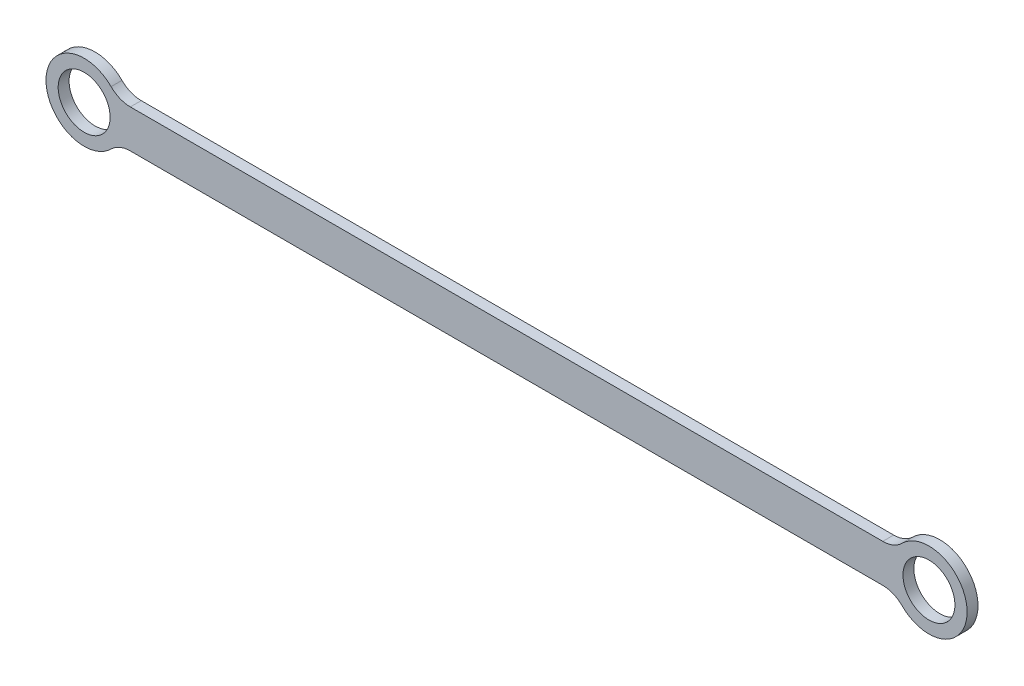
ISO-10303-21;
HEADER;
FILE_DESCRIPTION(('STEP AP214'),'2;1');
FILE_NAME('part.step','',(''),(''),'','','');
FILE_SCHEMA(('AUTOMOTIVE_DESIGN { 1 0 10303 214 1 1 1 1 }'));
ENDSEC;
DATA;
#1=APPLICATION_CONTEXT('core data for automotive mechanical design processes');
#2=APPLICATION_PROTOCOL_DEFINITION('international standard','automotive_design',2000,#1);
#3=PRODUCT_CONTEXT('',#1,'mechanical');
#4=PRODUCT('Part','Part','',(#3));
#5=PRODUCT_RELATED_PRODUCT_CATEGORY('part','',(#4));
#6=PRODUCT_DEFINITION_FORMATION('','',#4);
#7=PRODUCT_DEFINITION_CONTEXT('part definition',#1,'design');
#8=PRODUCT_DEFINITION('design','',#6,#7);
#9=PRODUCT_DEFINITION_SHAPE('','',#8);
#10=(LENGTH_UNIT() NAMED_UNIT(*) SI_UNIT(.MILLI.,.METRE.));
#11=(NAMED_UNIT(*) PLANE_ANGLE_UNIT() SI_UNIT($,.RADIAN.));
#12=(NAMED_UNIT(*) SI_UNIT($,.STERADIAN.) SOLID_ANGLE_UNIT());
#13=UNCERTAINTY_MEASURE_WITH_UNIT(LENGTH_MEASURE(1.E-05),#10,'distance_accuracy_value','');
#14=(GEOMETRIC_REPRESENTATION_CONTEXT(3) GLOBAL_UNCERTAINTY_ASSIGNED_CONTEXT((#13)) GLOBAL_UNIT_ASSIGNED_CONTEXT((#10,
#11,#12)) REPRESENTATION_CONTEXT('',''));
#15=CARTESIAN_POINT('',(0.,0.,0.));
#16=DIRECTION('',(0.,0.,1.));
#17=DIRECTION('',(1.,0.,0.));
#18=AXIS2_PLACEMENT_3D('',#15,#16,#17);
#19=CARTESIAN_POINT('',(138.057525521744,16.9986046060747,4.));
#20=DIRECTION('',(0.,0.,-1.));
#21=DIRECTION('',(-1.,0.,0.));
#22=AXIS2_PLACEMENT_3D('',#19,#20,#21);
#23=PLANE('',#22);
#24=CARTESIAN_POINT('',(138.057525521744,16.9986046060747,4.));
#25=DIRECTION('',(0.,0.,-1.));
#26=DIRECTION('',(-1.,0.,0.));
#27=AXIS2_PLACEMENT_3D('',#24,#25,#26);
#28=CIRCLE('',#27,10.);
#29=CARTESIAN_POINT('',(145.116889887684,9.91585268687692,4.));
#30=VERTEX_POINT('',#29);
#31=CARTESIAN_POINT('',(138.057525521744,6.99860460607469,4.));
#32=VERTEX_POINT('',#31);
#33=EDGE_CURVE('E164',#30,#32,#28,.T.);
#34=ORIENTED_EDGE('',*,*,#33,.T.);
#35=DIRECTION('',(-1.,0.,0.));
#36=VECTOR('',#35,1.);
#37=CARTESIAN_POINT('',(-138.057525521746,6.99860460607469,4.));
#38=LINE('',#37,#36);
#39=CARTESIAN_POINT('',(-138.057525521746,6.99860460607469,4.));
#40=VERTEX_POINT('',#39);
#41=EDGE_CURVE('E100',#32,#40,#38,.T.);
#42=ORIENTED_EDGE('',*,*,#41,.T.);
#43=CARTESIAN_POINT('',(-138.057525521746,16.9986046060747,4.));
#44=DIRECTION('',(0.,0.,-1.));
#45=DIRECTION('',(-1.,0.,0.));
#46=AXIS2_PLACEMENT_3D('',#43,#44,#45);
#47=CIRCLE('',#46,10.);
#48=CARTESIAN_POINT('',(-145.116889887685,9.9158526868767,4.));
#49=VERTEX_POINT('',#48);
#50=EDGE_CURVE('E185',#40,#49,#47,.T.);
#51=ORIENTED_EDGE('',*,*,#50,.T.);
#52=CARTESIAN_POINT('',(-155.,0.,4.));
#53=DIRECTION('',(0.,0.,1.));
#54=DIRECTION('',(-1.,0.,0.));
#55=AXIS2_PLACEMENT_3D('',#52,#53,#54);
#56=CIRCLE('',#55,13.9999999999993);
#57=CARTESIAN_POINT('',(-145.116889887685,-9.91585268687668,4.));
#58=VERTEX_POINT('',#57);
#59=EDGE_CURVE('E199',#49,#58,#56,.T.);
#60=ORIENTED_EDGE('',*,*,#59,.T.);
#61=CARTESIAN_POINT('',(-138.057525521746,-16.9986046060747,4.));
#62=DIRECTION('',(0.,0.,-1.));
#63=DIRECTION('',(1.,0.,0.));
#64=AXIS2_PLACEMENT_3D('',#61,#62,#63);
#65=CIRCLE('',#64,10.);
#66=CARTESIAN_POINT('',(-138.057525521746,-6.99860460607466,4.));
#67=VERTEX_POINT('',#66);
#68=EDGE_CURVE('E119',#58,#67,#65,.T.);
#69=ORIENTED_EDGE('',*,*,#68,.T.);
#70=DIRECTION('',(1.,0.,0.));
#71=VECTOR('',#70,1.);
#72=CARTESIAN_POINT('',(138.057525521744,-6.99860460607466,4.));
#73=LINE('',#72,#71);
#74=CARTESIAN_POINT('',(138.057525521744,-6.99860460607465,4.));
#75=VERTEX_POINT('',#74);
#76=EDGE_CURVE('E113',#67,#75,#73,.T.);
#77=ORIENTED_EDGE('',*,*,#76,.T.);
#78=CARTESIAN_POINT('',(138.057525521744,-16.9986046060747,4.));
#79=DIRECTION('',(0.,0.,-1.));
#80=DIRECTION('',(1.,0.,0.));
#81=AXIS2_PLACEMENT_3D('',#78,#79,#80);
#82=CIRCLE('',#81,10.);
#83=CARTESIAN_POINT('',(145.116889887684,-9.9158526868769,4.));
#84=VERTEX_POINT('',#83);
#85=EDGE_CURVE('E117',#75,#84,#82,.T.);
#86=ORIENTED_EDGE('',*,*,#85,.T.);
#87=CARTESIAN_POINT('',(155.,0.,4.));
#88=DIRECTION('',(0.,0.,1.));
#89=DIRECTION('',(-1.,0.,0.));
#90=AXIS2_PLACEMENT_3D('',#87,#88,#89);
#91=CIRCLE('',#90,14.);
#92=EDGE_CURVE('E57',#84,#30,#91,.T.);
#93=ORIENTED_EDGE('',*,*,#92,.T.);
#94=EDGE_LOOP('',(#34,#42,#51,#60,#69,#77,#86,#93));
#95=FACE_BOUND('',#94,.T.);
#96=CARTESIAN_POINT('',(-155.,0.,4.));
#97=DIRECTION('',(0.,0.,1.));
#98=DIRECTION('',(1.,0.,0.));
#99=AXIS2_PLACEMENT_3D('',#96,#97,#98);
#100=CIRCLE('',#99,9.53000000000001);
#101=CARTESIAN_POINT('',(-145.47,0.,4.));
#102=VERTEX_POINT('',#101);
#103=EDGE_CURVE('E146',#102,#102,#100,.T.);
#104=ORIENTED_EDGE('',*,*,#103,.F.);
#105=EDGE_LOOP('',(#104));
#106=FACE_BOUND('',#105,.T.);
#107=CARTESIAN_POINT('',(155.,0.,4.));
#108=DIRECTION('',(0.,0.,1.));
#109=DIRECTION('',(1.,0.,0.));
#110=AXIS2_PLACEMENT_3D('',#107,#108,#109);
#111=CIRCLE('',#110,9.52999999999996);
#112=CARTESIAN_POINT('',(164.53,0.,4.));
#113=VERTEX_POINT('',#112);
#114=EDGE_CURVE('E213',#113,#113,#111,.T.);
#115=ORIENTED_EDGE('',*,*,#114,.F.);
#116=EDGE_LOOP('',(#115));
#117=FACE_BOUND('',#116,.T.);
#118=ADVANCED_FACE('F39',(#95,#106,#117),#23,.F.);
#119=CARTESIAN_POINT('',(138.057525521744,16.9986046060747,0.));
#120=DIRECTION('',(0.,0.,-1.));
#121=DIRECTION('',(-1.,0.,0.));
#122=AXIS2_PLACEMENT_3D('',#119,#120,#121);
#123=PLANE('',#122);
#124=CARTESIAN_POINT('',(-155.,0.,0.));
#125=DIRECTION('',(0.,0.,1.));
#126=DIRECTION('',(1.,0.,0.));
#127=AXIS2_PLACEMENT_3D('',#124,#125,#126);
#128=CIRCLE('',#127,9.53000000000001);
#129=CARTESIAN_POINT('',(-145.47,0.,0.));
#130=VERTEX_POINT('',#129);
#131=EDGE_CURVE('E209',#130,#130,#128,.T.);
#132=ORIENTED_EDGE('',*,*,#131,.T.);
#133=EDGE_LOOP('',(#132));
#134=FACE_BOUND('',#133,.T.);
#135=CARTESIAN_POINT('',(138.057525521744,16.9986046060747,0.));
#136=DIRECTION('',(0.,0.,-1.));
#137=DIRECTION('',(-1.,0.,0.));
#138=AXIS2_PLACEMENT_3D('',#135,#136,#137);
#139=CIRCLE('',#138,10.);
#140=CARTESIAN_POINT('',(145.116889887684,9.91585268687692,0.));
#141=VERTEX_POINT('',#140);
#142=CARTESIAN_POINT('',(138.057525521744,6.99860460607469,0.));
#143=VERTEX_POINT('',#142);
#144=EDGE_CURVE('E141',#141,#143,#139,.T.);
#145=ORIENTED_EDGE('',*,*,#144,.F.);
#146=CARTESIAN_POINT('',(155.,0.,0.));
#147=DIRECTION('',(0.,0.,1.));
#148=DIRECTION('',(-1.,0.,0.));
#149=AXIS2_PLACEMENT_3D('',#146,#147,#148);
#150=CIRCLE('',#149,14.);
#151=CARTESIAN_POINT('',(145.116889887684,-9.9158526868769,0.));
#152=VERTEX_POINT('',#151);
#153=EDGE_CURVE('E92',#152,#141,#150,.T.);
#154=ORIENTED_EDGE('',*,*,#153,.F.);
#155=CARTESIAN_POINT('',(138.057525521744,-16.9986046060747,0.));
#156=DIRECTION('',(0.,0.,-1.));
#157=DIRECTION('',(1.,0.,0.));
#158=AXIS2_PLACEMENT_3D('',#155,#156,#157);
#159=CIRCLE('',#158,10.);
#160=CARTESIAN_POINT('',(138.057525521744,-6.99860460607465,0.));
#161=VERTEX_POINT('',#160);
#162=EDGE_CURVE('E86',#161,#152,#159,.T.);
#163=ORIENTED_EDGE('',*,*,#162,.F.);
#164=DIRECTION('',(1.,0.,0.));
#165=VECTOR('',#164,1.);
#166=CARTESIAN_POINT('',(138.057525521744,-6.99860460607466,0.));
#167=LINE('',#166,#165);
#168=CARTESIAN_POINT('',(-138.057525521746,-6.99860460607466,0.));
#169=VERTEX_POINT('',#168);
#170=EDGE_CURVE('E128',#169,#161,#167,.T.);
#171=ORIENTED_EDGE('',*,*,#170,.F.);
#172=CARTESIAN_POINT('',(-138.057525521746,-16.9986046060747,0.));
#173=DIRECTION('',(0.,0.,-1.));
#174=DIRECTION('',(1.,0.,0.));
#175=AXIS2_PLACEMENT_3D('',#172,#173,#174);
#176=CIRCLE('',#175,10.);
#177=CARTESIAN_POINT('',(-145.116889887685,-9.91585268687668,0.));
#178=VERTEX_POINT('',#177);
#179=EDGE_CURVE('E155',#178,#169,#176,.T.);
#180=ORIENTED_EDGE('',*,*,#179,.F.);
#181=CARTESIAN_POINT('',(-155.,0.,0.));
#182=DIRECTION('',(0.,0.,1.));
#183=DIRECTION('',(-1.,0.,0.));
#184=AXIS2_PLACEMENT_3D('',#181,#182,#183);
#185=CIRCLE('',#184,13.9999999999993);
#186=CARTESIAN_POINT('',(-145.116889887685,9.9158526868767,0.));
#187=VERTEX_POINT('',#186);
#188=EDGE_CURVE('E152',#187,#178,#185,.T.);
#189=ORIENTED_EDGE('',*,*,#188,.F.);
#190=CARTESIAN_POINT('',(-138.057525521746,16.9986046060747,0.));
#191=DIRECTION('',(0.,0.,-1.));
#192=DIRECTION('',(-1.,0.,0.));
#193=AXIS2_PLACEMENT_3D('',#190,#191,#192);
#194=CIRCLE('',#193,10.);
#195=CARTESIAN_POINT('',(-138.057525521746,6.99860460607469,0.));
#196=VERTEX_POINT('',#195);
#197=EDGE_CURVE('E149',#196,#187,#194,.T.);
#198=ORIENTED_EDGE('',*,*,#197,.F.);
#199=DIRECTION('',(-1.,0.,0.));
#200=VECTOR('',#199,1.);
#201=CARTESIAN_POINT('',(-138.057525521746,6.99860460607469,0.));
#202=LINE('',#201,#200);
#203=EDGE_CURVE('E145',#143,#196,#202,.T.);
#204=ORIENTED_EDGE('',*,*,#203,.F.);
#205=EDGE_LOOP('',(#145,#154,#163,#171,#180,#189,#198,#204));
#206=FACE_BOUND('',#205,.T.);
#207=CARTESIAN_POINT('',(155.,0.,0.));
#208=DIRECTION('',(0.,0.,1.));
#209=DIRECTION('',(1.,0.,0.));
#210=AXIS2_PLACEMENT_3D('',#207,#208,#209);
#211=CIRCLE('',#210,9.52999999999996);
#212=CARTESIAN_POINT('',(164.53,0.,0.));
#213=VERTEX_POINT('',#212);
#214=EDGE_CURVE('E217',#213,#213,#211,.T.);
#215=ORIENTED_EDGE('',*,*,#214,.T.);
#216=EDGE_LOOP('',(#215));
#217=FACE_BOUND('',#216,.T.);
#218=ADVANCED_FACE('F189',(#134,#206,#217),#123,.T.);
#219=CARTESIAN_POINT('',(138.057525521744,16.9986046060747,4.));
#220=DIRECTION('',(0.,0.,-1.));
#221=DIRECTION('',(-1.,0.,0.));
#222=AXIS2_PLACEMENT_3D('',#219,#220,#221);
#223=CYLINDRICAL_SURFACE('',#222,10.);
#224=ORIENTED_EDGE('',*,*,#144,.T.);
#225=DIRECTION('',(0.,0.,-1.));
#226=VECTOR('',#225,1.);
#227=CARTESIAN_POINT('',(138.057525521744,6.99860460607469,4.));
#228=LINE('',#227,#226);
#229=EDGE_CURVE('E11',#32,#143,#228,.T.);
#230=ORIENTED_EDGE('',*,*,#229,.F.);
#231=ORIENTED_EDGE('',*,*,#33,.F.);
#232=DIRECTION('',(0.,0.,-1.));
#233=VECTOR('',#232,1.);
#234=CARTESIAN_POINT('',(145.116889887684,9.91585268687692,4.));
#235=LINE('',#234,#233);
#236=EDGE_CURVE('E137',#30,#141,#235,.T.);
#237=ORIENTED_EDGE('',*,*,#236,.T.);
#238=EDGE_LOOP('',(#224,#230,#231,#237));
#239=FACE_BOUND('',#238,.T.);
#240=ADVANCED_FACE('F41',(#239),#223,.F.);
#241=CARTESIAN_POINT('',(-138.057525521746,6.99860460607469,4.));
#242=DIRECTION('',(0.,-1.,0.));
#243=DIRECTION('',(0.,0.,-1.));
#244=AXIS2_PLACEMENT_3D('',#241,#242,#243);
#245=PLANE('',#244);
#246=ORIENTED_EDGE('',*,*,#203,.T.);
#247=DIRECTION('',(0.,0.,-1.));
#248=VECTOR('',#247,1.);
#249=CARTESIAN_POINT('',(-138.057525521746,6.99860460607469,4.));
#250=LINE('',#249,#248);
#251=EDGE_CURVE('E49',#40,#196,#250,.T.);
#252=ORIENTED_EDGE('',*,*,#251,.F.);
#253=ORIENTED_EDGE('',*,*,#41,.F.);
#254=ORIENTED_EDGE('',*,*,#229,.T.);
#255=EDGE_LOOP('',(#246,#252,#253,#254));
#256=FACE_BOUND('',#255,.T.);
#257=ADVANCED_FACE('F251',(#256),#245,.F.);
#258=CARTESIAN_POINT('',(-138.057525521746,16.9986046060747,4.));
#259=DIRECTION('',(0.,0.,-1.));
#260=DIRECTION('',(-1.,0.,0.));
#261=AXIS2_PLACEMENT_3D('',#258,#259,#260);
#262=CYLINDRICAL_SURFACE('',#261,10.);
#263=ORIENTED_EDGE('',*,*,#197,.T.);
#264=DIRECTION('',(0.,0.,-1.));
#265=VECTOR('',#264,1.);
#266=CARTESIAN_POINT('',(-145.116889887685,9.9158526868767,4.));
#267=LINE('',#266,#265);
#268=EDGE_CURVE('E175',#49,#187,#267,.T.);
#269=ORIENTED_EDGE('',*,*,#268,.F.);
#270=ORIENTED_EDGE('',*,*,#50,.F.);
#271=ORIENTED_EDGE('',*,*,#251,.T.);
#272=EDGE_LOOP('',(#263,#269,#270,#271));
#273=FACE_BOUND('',#272,.T.);
#274=ADVANCED_FACE('F183',(#273),#262,.F.);
#275=CARTESIAN_POINT('',(-155.,0.,4.));
#276=DIRECTION('',(0.,0.,-1.));
#277=DIRECTION('',(-1.,0.,0.));
#278=AXIS2_PLACEMENT_3D('',#275,#276,#277);
#279=CYLINDRICAL_SURFACE('',#278,13.9999999999993);
#280=ORIENTED_EDGE('',*,*,#188,.T.);
#281=DIRECTION('',(0.,0.,-1.));
#282=VECTOR('',#281,1.);
#283=CARTESIAN_POINT('',(-145.116889887685,-9.91585268687668,4.));
#284=LINE('',#283,#282);
#285=EDGE_CURVE('E171',#58,#178,#284,.T.);
#286=ORIENTED_EDGE('',*,*,#285,.F.);
#287=ORIENTED_EDGE('',*,*,#59,.F.);
#288=ORIENTED_EDGE('',*,*,#268,.T.);
#289=EDGE_LOOP('',(#280,#286,#287,#288));
#290=FACE_BOUND('',#289,.T.);
#291=ADVANCED_FACE('F194',(#290),#279,.T.);
#292=CARTESIAN_POINT('',(-138.057525521746,-16.9986046060747,4.));
#293=DIRECTION('',(0.,0.,-1.));
#294=DIRECTION('',(-1.,0.,0.));
#295=AXIS2_PLACEMENT_3D('',#292,#293,#294);
#296=CYLINDRICAL_SURFACE('',#295,10.);
#297=ORIENTED_EDGE('',*,*,#179,.T.);
#298=DIRECTION('',(0.,0.,-1.));
#299=VECTOR('',#298,1.);
#300=CARTESIAN_POINT('',(-138.057525521746,-6.99860460607466,4.));
#301=LINE('',#300,#299);
#302=EDGE_CURVE('E130',#67,#169,#301,.T.);
#303=ORIENTED_EDGE('',*,*,#302,.F.);
#304=ORIENTED_EDGE('',*,*,#68,.F.);
#305=ORIENTED_EDGE('',*,*,#285,.T.);
#306=EDGE_LOOP('',(#297,#303,#304,#305));
#307=FACE_BOUND('',#306,.T.);
#308=ADVANCED_FACE('F197',(#307),#296,.F.);
#309=CARTESIAN_POINT('',(138.057525521744,-6.99860460607466,4.));
#310=DIRECTION('',(0.,1.,0.));
#311=DIRECTION('',(0.,0.,1.));
#312=AXIS2_PLACEMENT_3D('',#309,#310,#311);
#313=PLANE('',#312);
#314=ORIENTED_EDGE('',*,*,#170,.T.);
#315=DIRECTION('',(0.,0.,-1.));
#316=VECTOR('',#315,1.);
#317=CARTESIAN_POINT('',(138.057525521744,-6.99860460607465,4.));
#318=LINE('',#317,#316);
#319=EDGE_CURVE('E125',#75,#161,#318,.T.);
#320=ORIENTED_EDGE('',*,*,#319,.F.);
#321=ORIENTED_EDGE('',*,*,#76,.F.);
#322=ORIENTED_EDGE('',*,*,#302,.T.);
#323=EDGE_LOOP('',(#314,#320,#321,#322));
#324=FACE_BOUND('',#323,.T.);
#325=ADVANCED_FACE('F126',(#324),#313,.F.);
#326=CARTESIAN_POINT('',(138.057525521744,-16.9986046060747,4.));
#327=DIRECTION('',(0.,0.,-1.));
#328=DIRECTION('',(-1.,0.,0.));
#329=AXIS2_PLACEMENT_3D('',#326,#327,#328);
#330=CYLINDRICAL_SURFACE('',#329,10.);
#331=ORIENTED_EDGE('',*,*,#162,.T.);
#332=DIRECTION('',(0.,0.,-1.));
#333=VECTOR('',#332,1.);
#334=CARTESIAN_POINT('',(145.116889887684,-9.9158526868769,4.));
#335=LINE('',#334,#333);
#336=EDGE_CURVE('E131',#84,#152,#335,.T.);
#337=ORIENTED_EDGE('',*,*,#336,.F.);
#338=ORIENTED_EDGE('',*,*,#85,.F.);
#339=ORIENTED_EDGE('',*,*,#319,.T.);
#340=EDGE_LOOP('',(#331,#337,#338,#339));
#341=FACE_BOUND('',#340,.T.);
#342=ADVANCED_FACE('F133',(#341),#330,.F.);
#343=CARTESIAN_POINT('',(155.,0.,4.));
#344=DIRECTION('',(0.,0.,-1.));
#345=DIRECTION('',(-1.,0.,0.));
#346=AXIS2_PLACEMENT_3D('',#343,#344,#345);
#347=CYLINDRICAL_SURFACE('',#346,14.);
#348=ORIENTED_EDGE('',*,*,#153,.T.);
#349=ORIENTED_EDGE('',*,*,#236,.F.);
#350=ORIENTED_EDGE('',*,*,#92,.F.);
#351=ORIENTED_EDGE('',*,*,#336,.T.);
#352=EDGE_LOOP('',(#348,#349,#350,#351));
#353=FACE_BOUND('',#352,.T.);
#354=ADVANCED_FACE('F239',(#353),#347,.T.);
#355=CARTESIAN_POINT('',(-155.,0.,4.));
#356=DIRECTION('',(0.,0.,-1.));
#357=DIRECTION('',(-1.,0.,0.));
#358=AXIS2_PLACEMENT_3D('',#355,#356,#357);
#359=CYLINDRICAL_SURFACE('',#358,9.53000000000001);
#360=ORIENTED_EDGE('',*,*,#103,.T.);
#361=EDGE_LOOP('',(#360));
#362=FACE_BOUND('',#361,.T.);
#363=ORIENTED_EDGE('',*,*,#131,.F.);
#364=EDGE_LOOP('',(#363));
#365=FACE_BOUND('',#364,.T.);
#366=ADVANCED_FACE('F236',(#362,#365),#359,.F.);
#367=CARTESIAN_POINT('',(155.,0.,4.));
#368=DIRECTION('',(0.,0.,-1.));
#369=DIRECTION('',(-1.,0.,0.));
#370=AXIS2_PLACEMENT_3D('',#367,#368,#369);
#371=CYLINDRICAL_SURFACE('',#370,9.52999999999996);
#372=ORIENTED_EDGE('',*,*,#114,.T.);
#373=EDGE_LOOP('',(#372));
#374=FACE_BOUND('',#373,.T.);
#375=ORIENTED_EDGE('',*,*,#214,.F.);
#376=EDGE_LOOP('',(#375));
#377=FACE_BOUND('',#376,.T.);
#378=ADVANCED_FACE('F225',(#374,#377),#371,.F.);
#379=CLOSED_SHELL('',(#118,#218,#240,#257,#274,#291,#308,#325,#342,#354,#366,#378));
#380=MANIFOLD_SOLID_BREP('B2',#379);
#381=ADVANCED_BREP_SHAPE_REPRESENTATION('',(#18,#380),#14);
#382=SHAPE_DEFINITION_REPRESENTATION(#9,#381);
ENDSEC;
END-ISO-10303-21;
